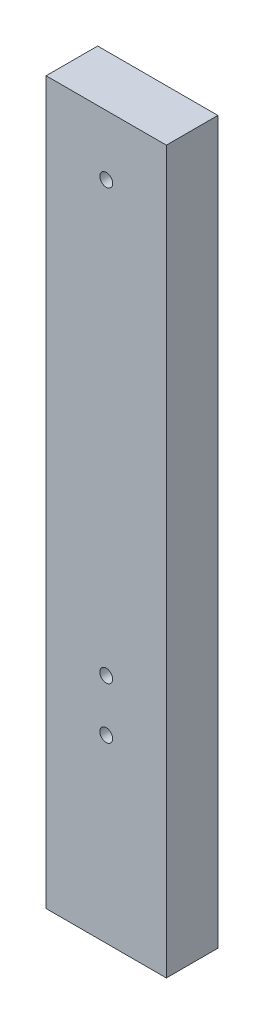
ISO-10303-21;
HEADER;
FILE_DESCRIPTION(('STEP AP214'),'2;1');
FILE_NAME('part.step','',(''),(''),'','','');
FILE_SCHEMA(('AUTOMOTIVE_DESIGN { 1 0 10303 214 1 1 1 1 }'));
ENDSEC;
DATA;
#1=APPLICATION_CONTEXT('core data for automotive mechanical design processes');
#2=APPLICATION_PROTOCOL_DEFINITION('international standard','automotive_design',2000,#1);
#3=PRODUCT_CONTEXT('',#1,'mechanical');
#4=PRODUCT('Part','Part','',(#3));
#5=PRODUCT_RELATED_PRODUCT_CATEGORY('part','',(#4));
#6=PRODUCT_DEFINITION_FORMATION('','',#4);
#7=PRODUCT_DEFINITION_CONTEXT('part definition',#1,'design');
#8=PRODUCT_DEFINITION('design','',#6,#7);
#9=PRODUCT_DEFINITION_SHAPE('','',#8);
#10=(LENGTH_UNIT() NAMED_UNIT(*) SI_UNIT(.MILLI.,.METRE.));
#11=(NAMED_UNIT(*) PLANE_ANGLE_UNIT() SI_UNIT($,.RADIAN.));
#12=(NAMED_UNIT(*) SI_UNIT($,.STERADIAN.) SOLID_ANGLE_UNIT());
#13=UNCERTAINTY_MEASURE_WITH_UNIT(LENGTH_MEASURE(1.E-05),#10,'distance_accuracy_value','');
#14=(GEOMETRIC_REPRESENTATION_CONTEXT(3) GLOBAL_UNCERTAINTY_ASSIGNED_CONTEXT((#13)) GLOBAL_UNIT_ASSIGNED_CONTEXT((#10,
#11,#12)) REPRESENTATION_CONTEXT('',''));
#15=CARTESIAN_POINT('',(0.,0.,0.));
#16=DIRECTION('',(0.,0.,1.));
#17=DIRECTION('',(1.,0.,0.));
#18=AXIS2_PLACEMENT_3D('',#15,#16,#17);
#19=CARTESIAN_POINT('',(0.,0.,38.1));
#20=DIRECTION('',(1.,0.,0.));
#21=DIRECTION('',(0.,0.,-1.));
#22=AXIS2_PLACEMENT_3D('',#19,#20,#21);
#23=PLANE('',#22);
#24=DIRECTION('',(0.,-1.,0.));
#25=VECTOR('',#24,1.);
#26=CARTESIAN_POINT('',(0.,0.,0.));
#27=LINE('',#26,#25);
#28=CARTESIAN_POINT('',(0.,533.4,0.));
#29=VERTEX_POINT('',#28);
#30=CARTESIAN_POINT('',(0.,0.,0.));
#31=VERTEX_POINT('',#30);
#32=EDGE_CURVE('E99',#29,#31,#27,.T.);
#33=ORIENTED_EDGE('',*,*,#32,.T.);
#34=DIRECTION('',(0.,0.,-1.));
#35=VECTOR('',#34,1.);
#36=CARTESIAN_POINT('',(0.,0.,38.1));
#37=LINE('',#36,#35);
#38=CARTESIAN_POINT('',(0.,0.,38.1));
#39=VERTEX_POINT('',#38);
#40=EDGE_CURVE('E11',#39,#31,#37,.T.);
#41=ORIENTED_EDGE('',*,*,#40,.F.);
#42=DIRECTION('',(0.,-1.,0.));
#43=VECTOR('',#42,1.);
#44=CARTESIAN_POINT('',(0.,0.,38.1));
#45=LINE('',#44,#43);
#46=CARTESIAN_POINT('',(0.,533.4,38.1));
#47=VERTEX_POINT('',#46);
#48=EDGE_CURVE('E87',#47,#39,#45,.T.);
#49=ORIENTED_EDGE('',*,*,#48,.F.);
#50=DIRECTION('',(0.,0.,-1.));
#51=VECTOR('',#50,1.);
#52=CARTESIAN_POINT('',(0.,533.4,38.1));
#53=LINE('',#52,#51);
#54=EDGE_CURVE('E95',#47,#29,#53,.T.);
#55=ORIENTED_EDGE('',*,*,#54,.T.);
#56=EDGE_LOOP('',(#33,#41,#49,#55));
#57=FACE_BOUND('',#56,.T.);
#58=ADVANCED_FACE('F36',(#57),#23,.F.);
#59=CARTESIAN_POINT('',(0.,0.,38.1));
#60=DIRECTION('',(0.,1.,0.));
#61=DIRECTION('',(0.,0.,1.));
#62=AXIS2_PLACEMENT_3D('',#59,#60,#61);
#63=PLANE('',#62);
#64=DIRECTION('',(1.,0.,0.));
#65=VECTOR('',#64,1.);
#66=CARTESIAN_POINT('',(0.,0.,0.));
#67=LINE('',#66,#65);
#68=CARTESIAN_POINT('',(88.9,0.,0.));
#69=VERTEX_POINT('',#68);
#70=EDGE_CURVE('E91',#31,#69,#67,.T.);
#71=ORIENTED_EDGE('',*,*,#70,.T.);
#72=DIRECTION('',(0.,0.,-1.));
#73=VECTOR('',#72,1.);
#74=CARTESIAN_POINT('',(88.9,0.,38.1));
#75=LINE('',#74,#73);
#76=CARTESIAN_POINT('',(88.9,0.,38.1));
#77=VERTEX_POINT('',#76);
#78=EDGE_CURVE('E44',#77,#69,#75,.T.);
#79=ORIENTED_EDGE('',*,*,#78,.F.);
#80=DIRECTION('',(1.,0.,0.));
#81=VECTOR('',#80,1.);
#82=CARTESIAN_POINT('',(0.,0.,38.1));
#83=LINE('',#82,#81);
#84=EDGE_CURVE('E82',#39,#77,#83,.T.);
#85=ORIENTED_EDGE('',*,*,#84,.F.);
#86=ORIENTED_EDGE('',*,*,#40,.T.);
#87=EDGE_LOOP('',(#71,#79,#85,#86));
#88=FACE_BOUND('',#87,.T.);
#89=ADVANCED_FACE('F90',(#88),#63,.F.);
#90=CARTESIAN_POINT('',(88.9,0.,38.1));
#91=DIRECTION('',(-1.,0.,0.));
#92=DIRECTION('',(0.,0.,1.));
#93=AXIS2_PLACEMENT_3D('',#90,#91,#92);
#94=PLANE('',#93);
#95=DIRECTION('',(0.,1.,0.));
#96=VECTOR('',#95,1.);
#97=CARTESIAN_POINT('',(88.9,0.,0.));
#98=LINE('',#97,#96);
#99=CARTESIAN_POINT('',(88.9,533.4,0.));
#100=VERTEX_POINT('',#99);
#101=EDGE_CURVE('E69',#69,#100,#98,.T.);
#102=ORIENTED_EDGE('',*,*,#101,.T.);
#103=DIRECTION('',(0.,0.,-1.));
#104=VECTOR('',#103,1.);
#105=CARTESIAN_POINT('',(88.9,533.4,38.1));
#106=LINE('',#105,#104);
#107=CARTESIAN_POINT('',(88.9,533.4,38.1));
#108=VERTEX_POINT('',#107);
#109=EDGE_CURVE('E92',#108,#100,#106,.T.);
#110=ORIENTED_EDGE('',*,*,#109,.F.);
#111=DIRECTION('',(0.,1.,0.));
#112=VECTOR('',#111,1.);
#113=CARTESIAN_POINT('',(88.9,0.,38.1));
#114=LINE('',#113,#112);
#115=EDGE_CURVE('E85',#77,#108,#114,.T.);
#116=ORIENTED_EDGE('',*,*,#115,.F.);
#117=ORIENTED_EDGE('',*,*,#78,.T.);
#118=EDGE_LOOP('',(#102,#110,#116,#117));
#119=FACE_BOUND('',#118,.T.);
#120=ADVANCED_FACE('F93',(#119),#94,.F.);
#121=CARTESIAN_POINT('',(0.,533.4,38.1));
#122=DIRECTION('',(0.,-1.,0.));
#123=DIRECTION('',(0.,0.,-1.));
#124=AXIS2_PLACEMENT_3D('',#121,#122,#123);
#125=PLANE('',#124);
#126=DIRECTION('',(-1.,0.,0.));
#127=VECTOR('',#126,1.);
#128=CARTESIAN_POINT('',(0.,533.4,0.));
#129=LINE('',#128,#127);
#130=EDGE_CURVE('E75',#100,#29,#129,.T.);
#131=ORIENTED_EDGE('',*,*,#130,.T.);
#132=ORIENTED_EDGE('',*,*,#54,.F.);
#133=DIRECTION('',(-1.,0.,0.));
#134=VECTOR('',#133,1.);
#135=CARTESIAN_POINT('',(0.,533.4,38.1));
#136=LINE('',#135,#134);
#137=EDGE_CURVE('E52',#108,#47,#136,.T.);
#138=ORIENTED_EDGE('',*,*,#137,.F.);
#139=ORIENTED_EDGE('',*,*,#109,.T.);
#140=EDGE_LOOP('',(#131,#132,#138,#139));
#141=FACE_BOUND('',#140,.T.);
#142=ADVANCED_FACE('F107',(#141),#125,.F.);
#143=CARTESIAN_POINT('',(0.,0.,38.1));
#144=DIRECTION('',(0.,0.,-1.));
#145=DIRECTION('',(-1.,0.,0.));
#146=AXIS2_PLACEMENT_3D('',#143,#144,#145);
#147=PLANE('',#146);
#148=CARTESIAN_POINT('',(44.45,171.45,38.1));
#149=DIRECTION('',(0.,0.,1.));
#150=DIRECTION('',(1.,0.,0.));
#151=AXIS2_PLACEMENT_3D('',#148,#149,#150);
#152=CIRCLE('',#151,4.7625);
#153=CARTESIAN_POINT('',(49.2125,171.45,38.1));
#154=VERTEX_POINT('',#153);
#155=EDGE_CURVE('E125',#154,#154,#152,.T.);
#156=ORIENTED_EDGE('',*,*,#155,.F.);
#157=EDGE_LOOP('',(#156));
#158=FACE_BOUND('',#157,.T.);
#159=CARTESIAN_POINT('',(44.45,133.35,38.1));
#160=DIRECTION('',(0.,0.,1.));
#161=DIRECTION('',(1.,0.,0.));
#162=AXIS2_PLACEMENT_3D('',#159,#160,#161);
#163=CIRCLE('',#162,4.7625);
#164=CARTESIAN_POINT('',(49.2125,133.35,38.1));
#165=VERTEX_POINT('',#164);
#166=EDGE_CURVE('E119',#165,#165,#163,.T.);
#167=ORIENTED_EDGE('',*,*,#166,.F.);
#168=EDGE_LOOP('',(#167));
#169=FACE_BOUND('',#168,.T.);
#170=CARTESIAN_POINT('',(44.45,488.95,38.1));
#171=DIRECTION('',(0.,0.,1.));
#172=DIRECTION('',(1.,0.,0.));
#173=AXIS2_PLACEMENT_3D('',#170,#171,#172);
#174=CIRCLE('',#173,4.76249999999999);
#175=CARTESIAN_POINT('',(49.2125,488.95,38.1));
#176=VERTEX_POINT('',#175);
#177=EDGE_CURVE('E115',#176,#176,#174,.T.);
#178=ORIENTED_EDGE('',*,*,#177,.F.);
#179=EDGE_LOOP('',(#178));
#180=FACE_BOUND('',#179,.T.);
#181=ORIENTED_EDGE('',*,*,#48,.T.);
#182=ORIENTED_EDGE('',*,*,#84,.T.);
#183=ORIENTED_EDGE('',*,*,#115,.T.);
#184=ORIENTED_EDGE('',*,*,#137,.T.);
#185=EDGE_LOOP('',(#181,#182,#183,#184));
#186=FACE_BOUND('',#185,.T.);
#187=ADVANCED_FACE('F83',(#158,#169,#180,#186),#147,.F.);
#188=CARTESIAN_POINT('',(0.,0.,0.));
#189=DIRECTION('',(0.,0.,-1.));
#190=DIRECTION('',(-1.,0.,0.));
#191=AXIS2_PLACEMENT_3D('',#188,#189,#190);
#192=PLANE('',#191);
#193=CARTESIAN_POINT('',(44.45,171.45,0.));
#194=DIRECTION('',(0.,0.,1.));
#195=DIRECTION('',(1.,0.,0.));
#196=AXIS2_PLACEMENT_3D('',#193,#194,#195);
#197=CIRCLE('',#196,4.7625);
#198=CARTESIAN_POINT('',(49.2125,171.45,0.));
#199=VERTEX_POINT('',#198);
#200=EDGE_CURVE('E122',#199,#199,#197,.T.);
#201=ORIENTED_EDGE('',*,*,#200,.T.);
#202=EDGE_LOOP('',(#201));
#203=FACE_BOUND('',#202,.T.);
#204=CARTESIAN_POINT('',(44.45,133.35,0.));
#205=DIRECTION('',(0.,0.,1.));
#206=DIRECTION('',(1.,0.,0.));
#207=AXIS2_PLACEMENT_3D('',#204,#205,#206);
#208=CIRCLE('',#207,4.7625);
#209=CARTESIAN_POINT('',(49.2125,133.35,0.));
#210=VERTEX_POINT('',#209);
#211=EDGE_CURVE('E118',#210,#210,#208,.T.);
#212=ORIENTED_EDGE('',*,*,#211,.T.);
#213=EDGE_LOOP('',(#212));
#214=FACE_BOUND('',#213,.T.);
#215=CARTESIAN_POINT('',(44.45,488.95,0.));
#216=DIRECTION('',(0.,0.,-1.));
#217=DIRECTION('',(-1.,0.,0.));
#218=AXIS2_PLACEMENT_3D('',#215,#216,#217);
#219=CIRCLE('',#218,4.76249999999999);
#220=CARTESIAN_POINT('',(39.6875,488.95,0.));
#221=VERTEX_POINT('',#220);
#222=EDGE_CURVE('E102',#221,#221,#219,.T.);
#223=ORIENTED_EDGE('',*,*,#222,.F.);
#224=EDGE_LOOP('',(#223));
#225=FACE_BOUND('',#224,.T.);
#226=ORIENTED_EDGE('',*,*,#32,.F.);
#227=ORIENTED_EDGE('',*,*,#130,.F.);
#228=ORIENTED_EDGE('',*,*,#101,.F.);
#229=ORIENTED_EDGE('',*,*,#70,.F.);
#230=EDGE_LOOP('',(#226,#227,#228,#229));
#231=FACE_BOUND('',#230,.T.);
#232=ADVANCED_FACE('F110',(#203,#214,#225,#231),#192,.T.);
#233=CARTESIAN_POINT('',(44.45,488.95,38.1));
#234=DIRECTION('',(0.,0.,1.));
#235=DIRECTION('',(1.,0.,0.));
#236=AXIS2_PLACEMENT_3D('',#233,#234,#235);
#237=CYLINDRICAL_SURFACE('',#236,4.76249999999999);
#238=ORIENTED_EDGE('',*,*,#222,.T.);
#239=EDGE_LOOP('',(#238));
#240=FACE_BOUND('',#239,.T.);
#241=ORIENTED_EDGE('',*,*,#177,.T.);
#242=EDGE_LOOP('',(#241));
#243=FACE_BOUND('',#242,.T.);
#244=ADVANCED_FACE('F147',(#240,#243),#237,.F.);
#245=CARTESIAN_POINT('',(44.45,133.35,0.));
#246=DIRECTION('',(0.,0.,1.));
#247=DIRECTION('',(1.,0.,0.));
#248=AXIS2_PLACEMENT_3D('',#245,#246,#247);
#249=CYLINDRICAL_SURFACE('',#248,4.7625);
#250=CARTESIAN_POINT('',(49.2125,133.35,0.));
#251=CARTESIAN_POINT('',(49.2125,133.35,0.396875));
#252=CARTESIAN_POINT('',(49.2125,133.35,0.79375));
#253=CARTESIAN_POINT('',(49.2125,133.35,1.5875));
#254=CARTESIAN_POINT('',(49.2125,133.35,1.984375));
#255=CARTESIAN_POINT('',(49.2125,133.35,2.778125));
#256=CARTESIAN_POINT('',(49.2125,133.35,3.175));
#257=CARTESIAN_POINT('',(49.2125,133.35,3.96875));
#258=CARTESIAN_POINT('',(49.2125,133.35,4.365625));
#259=CARTESIAN_POINT('',(49.2125,133.35,5.159375));
#260=CARTESIAN_POINT('',(49.2125,133.35,5.55625));
#261=CARTESIAN_POINT('',(49.2125,133.35,6.35));
#262=CARTESIAN_POINT('',(49.2125,133.35,6.746875));
#263=CARTESIAN_POINT('',(49.2125,133.35,7.540625));
#264=CARTESIAN_POINT('',(49.2125,133.35,7.9375));
#265=CARTESIAN_POINT('',(49.2125,133.35,8.73125));
#266=CARTESIAN_POINT('',(49.2125,133.35,9.128125));
#267=CARTESIAN_POINT('',(49.2125,133.35,9.921875));
#268=CARTESIAN_POINT('',(49.2125,133.35,10.31875));
#269=CARTESIAN_POINT('',(49.2125,133.35,11.1125));
#270=CARTESIAN_POINT('',(49.2125,133.35,11.509375));
#271=CARTESIAN_POINT('',(49.2125,133.35,12.303125));
#272=CARTESIAN_POINT('',(49.2125,133.35,12.7));
#273=CARTESIAN_POINT('',(49.2125,133.35,13.49375));
#274=CARTESIAN_POINT('',(49.2125,133.35,13.890625));
#275=CARTESIAN_POINT('',(49.2125,133.35,14.684375));
#276=CARTESIAN_POINT('',(49.2125,133.35,15.08125));
#277=CARTESIAN_POINT('',(49.2125,133.35,15.875));
#278=CARTESIAN_POINT('',(49.2125,133.35,16.271875));
#279=CARTESIAN_POINT('',(49.2125,133.35,17.065625));
#280=CARTESIAN_POINT('',(49.2125,133.35,17.4625));
#281=CARTESIAN_POINT('',(49.2125,133.35,18.25625));
#282=CARTESIAN_POINT('',(49.2125,133.35,18.653125));
#283=CARTESIAN_POINT('',(49.2125,133.35,19.446875));
#284=CARTESIAN_POINT('',(49.2125,133.35,19.84375));
#285=CARTESIAN_POINT('',(49.2125,133.35,20.6375));
#286=CARTESIAN_POINT('',(49.2125,133.35,21.034375));
#287=CARTESIAN_POINT('',(49.2125,133.35,21.828125));
#288=CARTESIAN_POINT('',(49.2125,133.35,22.225));
#289=CARTESIAN_POINT('',(49.2125,133.35,23.01875));
#290=CARTESIAN_POINT('',(49.2125,133.35,23.415625));
#291=CARTESIAN_POINT('',(49.2125,133.35,24.209375));
#292=CARTESIAN_POINT('',(49.2125,133.35,24.60625));
#293=CARTESIAN_POINT('',(49.2125,133.35,25.4));
#294=CARTESIAN_POINT('',(49.2125,133.35,25.796875));
#295=CARTESIAN_POINT('',(49.2125,133.35,26.590625));
#296=CARTESIAN_POINT('',(49.2125,133.35,26.9875));
#297=CARTESIAN_POINT('',(49.2125,133.35,27.78125));
#298=CARTESIAN_POINT('',(49.2125,133.35,28.178125));
#299=CARTESIAN_POINT('',(49.2125,133.35,28.971875));
#300=CARTESIAN_POINT('',(49.2125,133.35,29.36875));
#301=CARTESIAN_POINT('',(49.2125,133.35,30.1625));
#302=CARTESIAN_POINT('',(49.2125,133.35,30.559375));
#303=CARTESIAN_POINT('',(49.2125,133.35,31.353125));
#304=CARTESIAN_POINT('',(49.2125,133.35,31.75));
#305=CARTESIAN_POINT('',(49.2125,133.35,32.54375));
#306=CARTESIAN_POINT('',(49.2125,133.35,32.940625));
#307=CARTESIAN_POINT('',(49.2125,133.35,33.734375));
#308=CARTESIAN_POINT('',(49.2125,133.35,34.13125));
#309=CARTESIAN_POINT('',(49.2125,133.35,34.925));
#310=CARTESIAN_POINT('',(49.2125,133.35,35.321875));
#311=CARTESIAN_POINT('',(49.2125,133.35,36.115625));
#312=CARTESIAN_POINT('',(49.2125,133.35,36.5125));
#313=CARTESIAN_POINT('',(49.2125,133.35,37.30625));
#314=CARTESIAN_POINT('',(49.2125,133.35,37.703125));
#315=CARTESIAN_POINT('',(49.2125,133.35,38.1));
#316=B_SPLINE_CURVE_WITH_KNOTS('',3,(#250,#251,#252,#253,#254,#255,#256,#257,#258,#259,#260,
#261,#262,#263,#264,#265,#266,#267,#268,#269,#270,#271,#272,#273,#274,#275,#276,#277,#278,#279,
#280,#281,#282,#283,#284,#285,#286,#287,#288,#289,#290,#291,#292,#293,#294,#295,#296,#297,#298,
#299,#300,#301,#302,#303,#304,#305,#306,#307,#308,#309,#310,#311,#312,#313,#314,#315),
.UNSPECIFIED.,.F.,.F.,(4,2,2,2,2,2,2,2,2,2,2,2,2,2,2,2,2,2,2,2,2,2,2,2,2,2,2,2,2,2,2,2,4),(0.,
1.190625,2.38125,3.571875,4.7625,5.953125,7.14375,8.334375,9.525,10.715625,11.90625,13.096875,
14.2875,15.478125,16.66875,17.859375,19.05,20.240625,21.43125,22.621875,23.8125,25.003125,
26.19375,27.384375,28.575,29.765625,30.95625,32.146875,33.3375,34.528125,35.71875,36.909375,
38.1),.UNSPECIFIED.);
#317=EDGE_CURVE('BSEAM136',#210,#165,#316,.T.);
#318=ORIENTED_EDGE('',*,*,#211,.F.);
#319=ORIENTED_EDGE('',*,*,#166,.T.);
#320=ORIENTED_EDGE('',*,*,#317,.T.);
#321=ORIENTED_EDGE('',*,*,#317,.F.);
#322=EDGE_LOOP('',(#318,#320,#319,#321));
#323=FACE_BOUND('',#322,.T.);
#324=ADVANCED_FACE('F136',(#323),#249,.F.);
#325=CARTESIAN_POINT('',(44.45,171.45,0.));
#326=DIRECTION('',(0.,0.,1.));
#327=DIRECTION('',(1.,0.,0.));
#328=AXIS2_PLACEMENT_3D('',#325,#326,#327);
#329=CYLINDRICAL_SURFACE('',#328,4.7625);
#330=CARTESIAN_POINT('',(49.2125,171.45,0.));
#331=CARTESIAN_POINT('',(49.2125,171.45,0.396875));
#332=CARTESIAN_POINT('',(49.2125,171.45,0.79375));
#333=CARTESIAN_POINT('',(49.2125,171.45,1.5875));
#334=CARTESIAN_POINT('',(49.2125,171.45,1.984375));
#335=CARTESIAN_POINT('',(49.2125,171.45,2.778125));
#336=CARTESIAN_POINT('',(49.2125,171.45,3.175));
#337=CARTESIAN_POINT('',(49.2125,171.45,3.96875));
#338=CARTESIAN_POINT('',(49.2125,171.45,4.365625));
#339=CARTESIAN_POINT('',(49.2125,171.45,5.159375));
#340=CARTESIAN_POINT('',(49.2125,171.45,5.55625));
#341=CARTESIAN_POINT('',(49.2125,171.45,6.35));
#342=CARTESIAN_POINT('',(49.2125,171.45,6.746875));
#343=CARTESIAN_POINT('',(49.2125,171.45,7.540625));
#344=CARTESIAN_POINT('',(49.2125,171.45,7.9375));
#345=CARTESIAN_POINT('',(49.2125,171.45,8.73125));
#346=CARTESIAN_POINT('',(49.2125,171.45,9.128125));
#347=CARTESIAN_POINT('',(49.2125,171.45,9.921875));
#348=CARTESIAN_POINT('',(49.2125,171.45,10.31875));
#349=CARTESIAN_POINT('',(49.2125,171.45,11.1125));
#350=CARTESIAN_POINT('',(49.2125,171.45,11.509375));
#351=CARTESIAN_POINT('',(49.2125,171.45,12.303125));
#352=CARTESIAN_POINT('',(49.2125,171.45,12.7));
#353=CARTESIAN_POINT('',(49.2125,171.45,13.49375));
#354=CARTESIAN_POINT('',(49.2125,171.45,13.890625));
#355=CARTESIAN_POINT('',(49.2125,171.45,14.684375));
#356=CARTESIAN_POINT('',(49.2125,171.45,15.08125));
#357=CARTESIAN_POINT('',(49.2125,171.45,15.875));
#358=CARTESIAN_POINT('',(49.2125,171.45,16.271875));
#359=CARTESIAN_POINT('',(49.2125,171.45,17.065625));
#360=CARTESIAN_POINT('',(49.2125,171.45,17.4625));
#361=CARTESIAN_POINT('',(49.2125,171.45,18.25625));
#362=CARTESIAN_POINT('',(49.2125,171.45,18.653125));
#363=CARTESIAN_POINT('',(49.2125,171.45,19.446875));
#364=CARTESIAN_POINT('',(49.2125,171.45,19.84375));
#365=CARTESIAN_POINT('',(49.2125,171.45,20.6375));
#366=CARTESIAN_POINT('',(49.2125,171.45,21.034375));
#367=CARTESIAN_POINT('',(49.2125,171.45,21.828125));
#368=CARTESIAN_POINT('',(49.2125,171.45,22.225));
#369=CARTESIAN_POINT('',(49.2125,171.45,23.01875));
#370=CARTESIAN_POINT('',(49.2125,171.45,23.415625));
#371=CARTESIAN_POINT('',(49.2125,171.45,24.209375));
#372=CARTESIAN_POINT('',(49.2125,171.45,24.60625));
#373=CARTESIAN_POINT('',(49.2125,171.45,25.4));
#374=CARTESIAN_POINT('',(49.2125,171.45,25.796875));
#375=CARTESIAN_POINT('',(49.2125,171.45,26.590625));
#376=CARTESIAN_POINT('',(49.2125,171.45,26.9875));
#377=CARTESIAN_POINT('',(49.2125,171.45,27.78125));
#378=CARTESIAN_POINT('',(49.2125,171.45,28.178125));
#379=CARTESIAN_POINT('',(49.2125,171.45,28.971875));
#380=CARTESIAN_POINT('',(49.2125,171.45,29.36875));
#381=CARTESIAN_POINT('',(49.2125,171.45,30.1625));
#382=CARTESIAN_POINT('',(49.2125,171.45,30.559375));
#383=CARTESIAN_POINT('',(49.2125,171.45,31.353125));
#384=CARTESIAN_POINT('',(49.2125,171.45,31.75));
#385=CARTESIAN_POINT('',(49.2125,171.45,32.54375));
#386=CARTESIAN_POINT('',(49.2125,171.45,32.940625));
#387=CARTESIAN_POINT('',(49.2125,171.45,33.734375));
#388=CARTESIAN_POINT('',(49.2125,171.45,34.13125));
#389=CARTESIAN_POINT('',(49.2125,171.45,34.925));
#390=CARTESIAN_POINT('',(49.2125,171.45,35.321875));
#391=CARTESIAN_POINT('',(49.2125,171.45,36.115625));
#392=CARTESIAN_POINT('',(49.2125,171.45,36.5125));
#393=CARTESIAN_POINT('',(49.2125,171.45,37.30625));
#394=CARTESIAN_POINT('',(49.2125,171.45,37.703125));
#395=CARTESIAN_POINT('',(49.2125,171.45,38.1));
#396=B_SPLINE_CURVE_WITH_KNOTS('',3,(#330,#331,#332,#333,#334,#335,#336,#337,#338,#339,#340,
#341,#342,#343,#344,#345,#346,#347,#348,#349,#350,#351,#352,#353,#354,#355,#356,#357,#358,#359,
#360,#361,#362,#363,#364,#365,#366,#367,#368,#369,#370,#371,#372,#373,#374,#375,#376,#377,#378,
#379,#380,#381,#382,#383,#384,#385,#386,#387,#388,#389,#390,#391,#392,#393,#394,#395),
.UNSPECIFIED.,.F.,.F.,(4,2,2,2,2,2,2,2,2,2,2,2,2,2,2,2,2,2,2,2,2,2,2,2,2,2,2,2,2,2,2,2,4),(0.,
1.190625,2.38125,3.571875,4.7625,5.953125,7.14375,8.334375,9.525,10.715625,11.90625,13.096875,
14.2875,15.478125,16.66875,17.859375,19.05,20.240625,21.43125,22.621875,23.8125,25.003125,
26.19375,27.384375,28.575,29.765625,30.95625,32.146875,33.3375,34.528125,35.71875,36.909375,
38.1),.UNSPECIFIED.);
#397=EDGE_CURVE('BSEAM133',#199,#154,#396,.T.);
#398=ORIENTED_EDGE('',*,*,#200,.F.);
#399=ORIENTED_EDGE('',*,*,#155,.T.);
#400=ORIENTED_EDGE('',*,*,#397,.T.);
#401=ORIENTED_EDGE('',*,*,#397,.F.);
#402=EDGE_LOOP('',(#398,#400,#399,#401));
#403=FACE_BOUND('',#402,.T.);
#404=ADVANCED_FACE('F133',(#403),#329,.F.);
#405=CLOSED_SHELL('',(#58,#89,#120,#142,#187,#232,#244,#324,#404));
#406=MANIFOLD_SOLID_BREP('B2',#405);
#407=ADVANCED_BREP_SHAPE_REPRESENTATION('',(#18,#406),#14);
#408=SHAPE_DEFINITION_REPRESENTATION(#9,#407);
ENDSEC;
END-ISO-10303-21;
